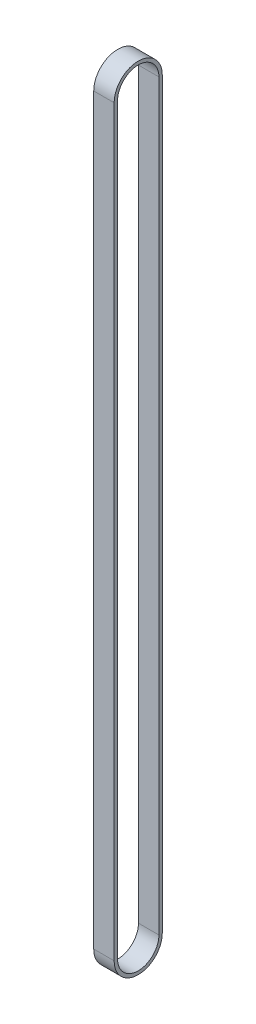
ISO-10303-21;
HEADER;
FILE_DESCRIPTION(('STEP AP214'),'2;1');
FILE_NAME('part.step','',(''),(''),'','','');
FILE_SCHEMA(('AUTOMOTIVE_DESIGN { 1 0 10303 214 1 1 1 1 }'));
ENDSEC;
DATA;
#1=APPLICATION_CONTEXT('core data for automotive mechanical design processes');
#2=APPLICATION_PROTOCOL_DEFINITION('international standard','automotive_design',2000,#1);
#3=PRODUCT_CONTEXT('',#1,'mechanical');
#4=PRODUCT('Part','Part','',(#3));
#5=PRODUCT_RELATED_PRODUCT_CATEGORY('part','',(#4));
#6=PRODUCT_DEFINITION_FORMATION('','',#4);
#7=PRODUCT_DEFINITION_CONTEXT('part definition',#1,'design');
#8=PRODUCT_DEFINITION('design','',#6,#7);
#9=PRODUCT_DEFINITION_SHAPE('','',#8);
#10=(LENGTH_UNIT() NAMED_UNIT(*) SI_UNIT(.MILLI.,.METRE.));
#11=(NAMED_UNIT(*) PLANE_ANGLE_UNIT() SI_UNIT($,.RADIAN.));
#12=(NAMED_UNIT(*) SI_UNIT($,.STERADIAN.) SOLID_ANGLE_UNIT());
#13=UNCERTAINTY_MEASURE_WITH_UNIT(LENGTH_MEASURE(1.E-05),#10,'distance_accuracy_value','');
#14=(GEOMETRIC_REPRESENTATION_CONTEXT(3) GLOBAL_UNCERTAINTY_ASSIGNED_CONTEXT((#13)) GLOBAL_UNIT_ASSIGNED_CONTEXT((#10,
#11,#12)) REPRESENTATION_CONTEXT('',''));
#15=CARTESIAN_POINT('',(0.,0.,0.));
#16=DIRECTION('',(0.,0.,1.));
#17=DIRECTION('',(1.,0.,0.));
#18=AXIS2_PLACEMENT_3D('',#15,#16,#17);
#19=CARTESIAN_POINT('',(6.05,-110.,0.));
#20=DIRECTION('',(1.,0.,0.));
#21=DIRECTION('',(0.,0.,-1.));
#22=AXIS2_PLACEMENT_3D('',#19,#20,#21);
#23=PLANE('',#22);
#24=CARTESIAN_POINT('',(6.05,-110.,0.));
#25=DIRECTION('',(1.,0.,0.));
#26=DIRECTION('',(0.,0.,-1.));
#27=AXIS2_PLACEMENT_3D('',#24,#25,#26);
#28=CIRCLE('',#27,7.12500000000004);
#29=CARTESIAN_POINT('',(6.05,-110.,7.12500000000004));
#30=VERTEX_POINT('',#29);
#31=CARTESIAN_POINT('',(6.05,-110.,-7.12500000000004));
#32=VERTEX_POINT('',#31);
#33=EDGE_CURVE('E145',#30,#32,#28,.T.);
#34=ORIENTED_EDGE('',*,*,#33,.T.);
#35=DIRECTION('',(0.,1.,0.));
#36=VECTOR('',#35,1.);
#37=CARTESIAN_POINT('',(6.05,-110.,-7.12500000000004));
#38=LINE('',#37,#36);
#39=CARTESIAN_POINT('',(6.05,110.,-7.12499999999996));
#40=VERTEX_POINT('',#39);
#41=EDGE_CURVE('E150',#32,#40,#38,.T.);
#42=ORIENTED_EDGE('',*,*,#41,.T.);
#43=CARTESIAN_POINT('',(6.05,110.,0.));
#44=DIRECTION('',(1.,0.,0.));
#45=DIRECTION('',(0.,0.,-1.));
#46=AXIS2_PLACEMENT_3D('',#43,#44,#45);
#47=CIRCLE('',#46,7.125);
#48=CARTESIAN_POINT('',(6.05,110.,7.12500000000004));
#49=VERTEX_POINT('',#48);
#50=EDGE_CURVE('E147',#40,#49,#47,.T.);
#51=ORIENTED_EDGE('',*,*,#50,.T.);
#52=DIRECTION('',(0.,-1.,0.));
#53=VECTOR('',#52,1.);
#54=CARTESIAN_POINT('',(6.05,-110.,7.12500000000004));
#55=LINE('',#54,#53);
#56=EDGE_CURVE('E155',#49,#30,#55,.T.);
#57=ORIENTED_EDGE('',*,*,#56,.T.);
#58=EDGE_LOOP('',(#34,#42,#51,#57));
#59=FACE_BOUND('',#58,.T.);
#60=DIRECTION('',(0.,1.,0.));
#61=VECTOR('',#60,1.);
#62=CARTESIAN_POINT('',(6.05,-110.,-6.12500000000004));
#63=LINE('',#62,#61);
#64=CARTESIAN_POINT('',(6.05,-110.,-6.12500000000004));
#65=VERTEX_POINT('',#64);
#66=CARTESIAN_POINT('',(6.05,110.,-6.125));
#67=VERTEX_POINT('',#66);
#68=EDGE_CURVE('E116',#65,#67,#63,.T.);
#69=ORIENTED_EDGE('',*,*,#68,.F.);
#70=CARTESIAN_POINT('',(6.05,-110.,0.));
#71=DIRECTION('',(1.,0.,0.));
#72=DIRECTION('',(0.,0.,-1.));
#73=AXIS2_PLACEMENT_3D('',#70,#71,#72);
#74=CIRCLE('',#73,6.12500000000004);
#75=CARTESIAN_POINT('',(6.05,-110.,6.12500000000004));
#76=VERTEX_POINT('',#75);
#77=EDGE_CURVE('E107',#76,#65,#74,.T.);
#78=ORIENTED_EDGE('',*,*,#77,.F.);
#79=DIRECTION('',(0.,-1.,0.));
#80=VECTOR('',#79,1.);
#81=CARTESIAN_POINT('',(6.05,-110.,6.12500000000004));
#82=LINE('',#81,#80);
#83=CARTESIAN_POINT('',(6.05,110.,6.12500000000008));
#84=VERTEX_POINT('',#83);
#85=EDGE_CURVE('E128',#84,#76,#82,.T.);
#86=ORIENTED_EDGE('',*,*,#85,.F.);
#87=CARTESIAN_POINT('',(6.05,110.,0.));
#88=DIRECTION('',(1.,0.,0.));
#89=DIRECTION('',(0.,0.,-1.));
#90=AXIS2_PLACEMENT_3D('',#87,#88,#89);
#91=CIRCLE('',#90,6.12500000000004);
#92=EDGE_CURVE('E126',#67,#84,#91,.T.);
#93=ORIENTED_EDGE('',*,*,#92,.F.);
#94=EDGE_LOOP('',(#69,#78,#86,#93));
#95=FACE_BOUND('',#94,.T.);
#96=ADVANCED_FACE('F43',(#59,#95),#23,.T.);
#97=CARTESIAN_POINT('',(0.,-110.,0.));
#98=DIRECTION('',(1.,0.,0.));
#99=DIRECTION('',(0.,0.,-1.));
#100=AXIS2_PLACEMENT_3D('',#97,#98,#99);
#101=PLANE('',#100);
#102=CARTESIAN_POINT('',(0.,-110.,0.));
#103=DIRECTION('',(1.,0.,0.));
#104=DIRECTION('',(0.,0.,-1.));
#105=AXIS2_PLACEMENT_3D('',#102,#103,#104);
#106=CIRCLE('',#105,7.12500000000004);
#107=CARTESIAN_POINT('',(0.,-110.,7.12500000000004));
#108=VERTEX_POINT('',#107);
#109=CARTESIAN_POINT('',(0.,-110.,-7.12500000000004));
#110=VERTEX_POINT('',#109);
#111=EDGE_CURVE('E123',#108,#110,#106,.T.);
#112=ORIENTED_EDGE('',*,*,#111,.F.);
#113=DIRECTION('',(0.,-1.,0.));
#114=VECTOR('',#113,1.);
#115=CARTESIAN_POINT('',(0.,-110.,7.12500000000004));
#116=LINE('',#115,#114);
#117=CARTESIAN_POINT('',(0.,110.,7.12500000000004));
#118=VERTEX_POINT('',#117);
#119=EDGE_CURVE('E146',#118,#108,#116,.T.);
#120=ORIENTED_EDGE('',*,*,#119,.F.);
#121=CARTESIAN_POINT('',(0.,110.,0.));
#122=DIRECTION('',(1.,0.,0.));
#123=DIRECTION('',(0.,0.,-1.));
#124=AXIS2_PLACEMENT_3D('',#121,#122,#123);
#125=CIRCLE('',#124,7.125);
#126=CARTESIAN_POINT('',(0.,110.,-7.12499999999996));
#127=VERTEX_POINT('',#126);
#128=EDGE_CURVE('E157',#127,#118,#125,.T.);
#129=ORIENTED_EDGE('',*,*,#128,.F.);
#130=DIRECTION('',(0.,1.,0.));
#131=VECTOR('',#130,1.);
#132=CARTESIAN_POINT('',(0.,-110.,-7.12500000000004));
#133=LINE('',#132,#131);
#134=EDGE_CURVE('E160',#110,#127,#133,.T.);
#135=ORIENTED_EDGE('',*,*,#134,.F.);
#136=EDGE_LOOP('',(#112,#120,#129,#135));
#137=FACE_BOUND('',#136,.T.);
#138=CARTESIAN_POINT('',(0.,-110.,0.));
#139=DIRECTION('',(1.,0.,0.));
#140=DIRECTION('',(0.,0.,-1.));
#141=AXIS2_PLACEMENT_3D('',#138,#139,#140);
#142=CIRCLE('',#141,6.12500000000004);
#143=CARTESIAN_POINT('',(0.,-110.,6.12500000000004));
#144=VERTEX_POINT('',#143);
#145=CARTESIAN_POINT('',(0.,-110.,-6.12500000000004));
#146=VERTEX_POINT('',#145);
#147=EDGE_CURVE('E66',#144,#146,#142,.T.);
#148=ORIENTED_EDGE('',*,*,#147,.T.);
#149=DIRECTION('',(0.,1.,0.));
#150=VECTOR('',#149,1.);
#151=CARTESIAN_POINT('',(0.,-110.,-6.12500000000004));
#152=LINE('',#151,#150);
#153=CARTESIAN_POINT('',(0.,110.,-6.125));
#154=VERTEX_POINT('',#153);
#155=EDGE_CURVE('E122',#146,#154,#152,.T.);
#156=ORIENTED_EDGE('',*,*,#155,.T.);
#157=CARTESIAN_POINT('',(0.,110.,0.));
#158=DIRECTION('',(1.,0.,0.));
#159=DIRECTION('',(0.,0.,-1.));
#160=AXIS2_PLACEMENT_3D('',#157,#158,#159);
#161=CIRCLE('',#160,6.12500000000004);
#162=CARTESIAN_POINT('',(0.,110.,6.12500000000008));
#163=VERTEX_POINT('',#162);
#164=EDGE_CURVE('E136',#154,#163,#161,.T.);
#165=ORIENTED_EDGE('',*,*,#164,.T.);
#166=DIRECTION('',(0.,-1.,0.));
#167=VECTOR('',#166,1.);
#168=CARTESIAN_POINT('',(0.,-110.,6.12500000000004));
#169=LINE('',#168,#167);
#170=EDGE_CURVE('E120',#163,#144,#169,.T.);
#171=ORIENTED_EDGE('',*,*,#170,.T.);
#172=EDGE_LOOP('',(#148,#156,#165,#171));
#173=FACE_BOUND('',#172,.T.);
#174=ADVANCED_FACE('F180',(#137,#173),#101,.F.);
#175=CARTESIAN_POINT('',(6.05,-110.,0.));
#176=DIRECTION('',(-1.,0.,0.));
#177=DIRECTION('',(0.,0.,1.));
#178=AXIS2_PLACEMENT_3D('',#175,#176,#177);
#179=CYLINDRICAL_SURFACE('',#178,7.12500000000004);
#180=ORIENTED_EDGE('',*,*,#111,.T.);
#181=DIRECTION('',(-1.,0.,0.));
#182=VECTOR('',#181,1.);
#183=CARTESIAN_POINT('',(6.05,-110.,-7.12500000000004));
#184=LINE('',#183,#182);
#185=EDGE_CURVE('E11',#32,#110,#184,.T.);
#186=ORIENTED_EDGE('',*,*,#185,.F.);
#187=ORIENTED_EDGE('',*,*,#33,.F.);
#188=DIRECTION('',(-1.,0.,0.));
#189=VECTOR('',#188,1.);
#190=CARTESIAN_POINT('',(6.05,-110.,7.12500000000004));
#191=LINE('',#190,#189);
#192=EDGE_CURVE('E152',#30,#108,#191,.T.);
#193=ORIENTED_EDGE('',*,*,#192,.T.);
#194=EDGE_LOOP('',(#180,#186,#187,#193));
#195=FACE_BOUND('',#194,.T.);
#196=ADVANCED_FACE('F44',(#195),#179,.T.);
#197=CARTESIAN_POINT('',(6.05,-110.,-7.12500000000004));
#198=DIRECTION('',(0.,0.,1.));
#199=DIRECTION('',(0.,-1.,0.));
#200=AXIS2_PLACEMENT_3D('',#197,#198,#199);
#201=PLANE('',#200);
#202=ORIENTED_EDGE('',*,*,#134,.T.);
#203=DIRECTION('',(-1.,0.,0.));
#204=VECTOR('',#203,1.);
#205=CARTESIAN_POINT('',(6.05,110.,-7.12499999999996));
#206=LINE('',#205,#204);
#207=EDGE_CURVE('E51',#40,#127,#206,.T.);
#208=ORIENTED_EDGE('',*,*,#207,.F.);
#209=ORIENTED_EDGE('',*,*,#41,.F.);
#210=ORIENTED_EDGE('',*,*,#185,.T.);
#211=EDGE_LOOP('',(#202,#208,#209,#210));
#212=FACE_BOUND('',#211,.T.);
#213=ADVANCED_FACE('F190',(#212),#201,.F.);
#214=CARTESIAN_POINT('',(6.05,110.,0.));
#215=DIRECTION('',(-1.,0.,0.));
#216=DIRECTION('',(0.,0.,1.));
#217=AXIS2_PLACEMENT_3D('',#214,#215,#216);
#218=CYLINDRICAL_SURFACE('',#217,7.125);
#219=ORIENTED_EDGE('',*,*,#128,.T.);
#220=DIRECTION('',(-1.,0.,0.));
#221=VECTOR('',#220,1.);
#222=CARTESIAN_POINT('',(6.05,110.,7.12500000000004));
#223=LINE('',#222,#221);
#224=EDGE_CURVE('E163',#49,#118,#223,.T.);
#225=ORIENTED_EDGE('',*,*,#224,.F.);
#226=ORIENTED_EDGE('',*,*,#50,.F.);
#227=ORIENTED_EDGE('',*,*,#207,.T.);
#228=EDGE_LOOP('',(#219,#225,#226,#227));
#229=FACE_BOUND('',#228,.T.);
#230=ADVANCED_FACE('F171',(#229),#218,.T.);
#231=CARTESIAN_POINT('',(6.05,-110.,7.12500000000004));
#232=DIRECTION('',(0.,0.,-1.));
#233=DIRECTION('',(-1.,0.,0.));
#234=AXIS2_PLACEMENT_3D('',#231,#232,#233);
#235=PLANE('',#234);
#236=ORIENTED_EDGE('',*,*,#119,.T.);
#237=ORIENTED_EDGE('',*,*,#192,.F.);
#238=ORIENTED_EDGE('',*,*,#56,.F.);
#239=ORIENTED_EDGE('',*,*,#224,.T.);
#240=EDGE_LOOP('',(#236,#237,#238,#239));
#241=FACE_BOUND('',#240,.T.);
#242=ADVANCED_FACE('F182',(#241),#235,.F.);
#243=CARTESIAN_POINT('',(6.05,-110.,0.));
#244=DIRECTION('',(-1.,0.,0.));
#245=DIRECTION('',(0.,0.,1.));
#246=AXIS2_PLACEMENT_3D('',#243,#244,#245);
#247=CYLINDRICAL_SURFACE('',#246,6.12500000000004);
#248=ORIENTED_EDGE('',*,*,#147,.F.);
#249=DIRECTION('',(-1.,0.,0.));
#250=VECTOR('',#249,1.);
#251=CARTESIAN_POINT('',(6.05,-110.,6.12500000000004));
#252=LINE('',#251,#250);
#253=EDGE_CURVE('E115',#76,#144,#252,.T.);
#254=ORIENTED_EDGE('',*,*,#253,.F.);
#255=ORIENTED_EDGE('',*,*,#77,.T.);
#256=DIRECTION('',(-1.,0.,0.));
#257=VECTOR('',#256,1.);
#258=CARTESIAN_POINT('',(6.05,-110.,-6.12500000000004));
#259=LINE('',#258,#257);
#260=EDGE_CURVE('E112',#65,#146,#259,.T.);
#261=ORIENTED_EDGE('',*,*,#260,.T.);
#262=EDGE_LOOP('',(#248,#254,#255,#261));
#263=FACE_BOUND('',#262,.T.);
#264=ADVANCED_FACE('F109',(#263),#247,.F.);
#265=CARTESIAN_POINT('',(6.05,-110.,-6.12500000000004));
#266=DIRECTION('',(0.,0.,1.));
#267=DIRECTION('',(0.,-1.,0.));
#268=AXIS2_PLACEMENT_3D('',#265,#266,#267);
#269=PLANE('',#268);
#270=ORIENTED_EDGE('',*,*,#155,.F.);
#271=ORIENTED_EDGE('',*,*,#260,.F.);
#272=ORIENTED_EDGE('',*,*,#68,.T.);
#273=DIRECTION('',(-1.,0.,0.));
#274=VECTOR('',#273,1.);
#275=CARTESIAN_POINT('',(6.05,110.,-6.125));
#276=LINE('',#275,#274);
#277=EDGE_CURVE('E124',#67,#154,#276,.T.);
#278=ORIENTED_EDGE('',*,*,#277,.T.);
#279=EDGE_LOOP('',(#270,#271,#272,#278));
#280=FACE_BOUND('',#279,.T.);
#281=ADVANCED_FACE('F119',(#280),#269,.T.);
#282=CARTESIAN_POINT('',(6.05,110.,0.));
#283=DIRECTION('',(-1.,0.,0.));
#284=DIRECTION('',(0.,0.,1.));
#285=AXIS2_PLACEMENT_3D('',#282,#283,#284);
#286=CYLINDRICAL_SURFACE('',#285,6.12500000000004);
#287=ORIENTED_EDGE('',*,*,#164,.F.);
#288=ORIENTED_EDGE('',*,*,#277,.F.);
#289=ORIENTED_EDGE('',*,*,#92,.T.);
#290=DIRECTION('',(-1.,0.,0.));
#291=VECTOR('',#290,1.);
#292=CARTESIAN_POINT('',(6.05,110.,6.12500000000008));
#293=LINE('',#292,#291);
#294=EDGE_CURVE('E59',#84,#163,#293,.T.);
#295=ORIENTED_EDGE('',*,*,#294,.T.);
#296=EDGE_LOOP('',(#287,#288,#289,#295));
#297=FACE_BOUND('',#296,.T.);
#298=ADVANCED_FACE('F209',(#297),#286,.F.);
#299=CARTESIAN_POINT('',(6.05,-110.,6.12500000000004));
#300=DIRECTION('',(0.,0.,-1.));
#301=DIRECTION('',(0.,1.,0.));
#302=AXIS2_PLACEMENT_3D('',#299,#300,#301);
#303=PLANE('',#302);
#304=ORIENTED_EDGE('',*,*,#170,.F.);
#305=ORIENTED_EDGE('',*,*,#294,.F.);
#306=ORIENTED_EDGE('',*,*,#85,.T.);
#307=ORIENTED_EDGE('',*,*,#253,.T.);
#308=EDGE_LOOP('',(#304,#305,#306,#307));
#309=FACE_BOUND('',#308,.T.);
#310=ADVANCED_FACE('F212',(#309),#303,.T.);
#311=CLOSED_SHELL('',(#96,#174,#196,#213,#230,#242,#264,#281,#298,#310));
#312=MANIFOLD_SOLID_BREP('B2',#311);
#313=ADVANCED_BREP_SHAPE_REPRESENTATION('',(#18,#312),#14);
#314=SHAPE_DEFINITION_REPRESENTATION(#9,#313);
ENDSEC;
END-ISO-10303-21;
